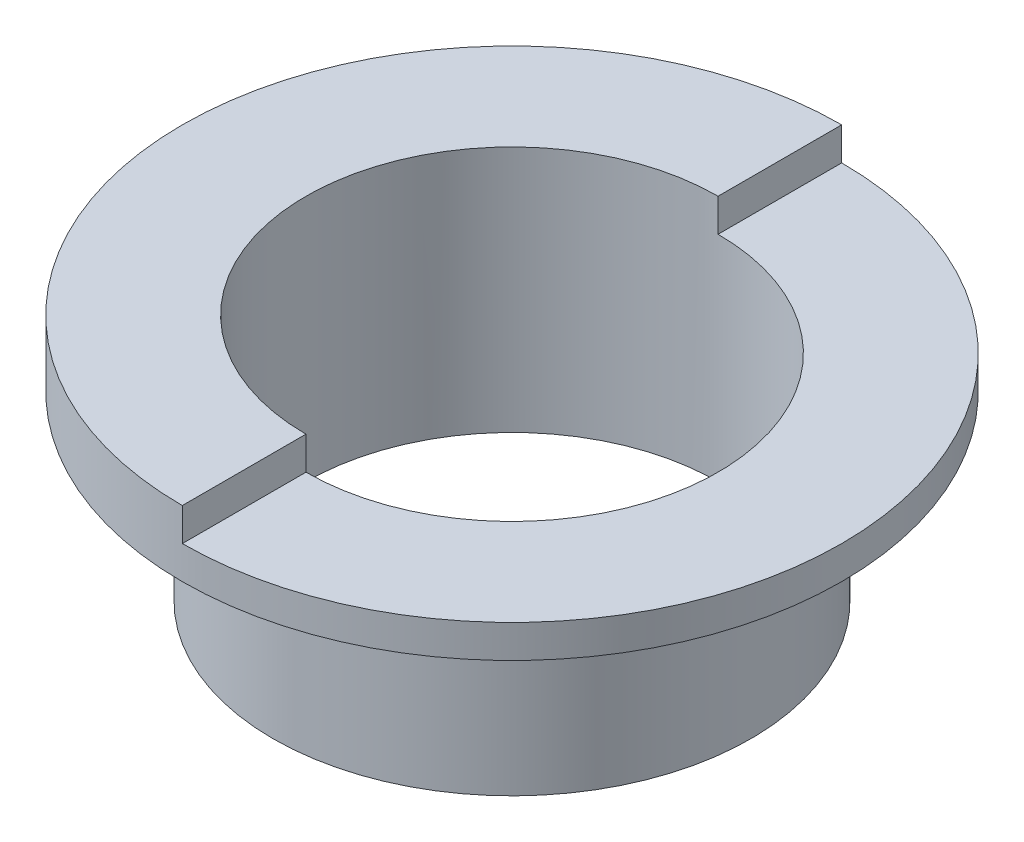
ISO-10303-21;
HEADER;
FILE_DESCRIPTION(('STEP AP214'),'2;1');
FILE_NAME('part.step','',(''),(''),'','','');
FILE_SCHEMA(('AUTOMOTIVE_DESIGN { 1 0 10303 214 1 1 1 1 }'));
ENDSEC;
DATA;
#1=APPLICATION_CONTEXT('core data for automotive mechanical design processes');
#2=APPLICATION_PROTOCOL_DEFINITION('international standard','automotive_design',2000,#1);
#3=PRODUCT_CONTEXT('',#1,'mechanical');
#4=PRODUCT('Part','Part','',(#3));
#5=PRODUCT_RELATED_PRODUCT_CATEGORY('part','',(#4));
#6=PRODUCT_DEFINITION_FORMATION('','',#4);
#7=PRODUCT_DEFINITION_CONTEXT('part definition',#1,'design');
#8=PRODUCT_DEFINITION('design','',#6,#7);
#9=PRODUCT_DEFINITION_SHAPE('','',#8);
#10=(LENGTH_UNIT() NAMED_UNIT(*) SI_UNIT(.MILLI.,.METRE.));
#11=(NAMED_UNIT(*) PLANE_ANGLE_UNIT() SI_UNIT($,.RADIAN.));
#12=(NAMED_UNIT(*) SI_UNIT($,.STERADIAN.) SOLID_ANGLE_UNIT());
#13=UNCERTAINTY_MEASURE_WITH_UNIT(LENGTH_MEASURE(1.E-05),#10,'distance_accuracy_value','');
#14=(GEOMETRIC_REPRESENTATION_CONTEXT(3) GLOBAL_UNCERTAINTY_ASSIGNED_CONTEXT((#13)) GLOBAL_UNIT_ASSIGNED_CONTEXT((#10,
#11,#12)) REPRESENTATION_CONTEXT('',''));
#15=CARTESIAN_POINT('',(0.,0.,0.));
#16=DIRECTION('',(0.,0.,1.));
#17=DIRECTION('',(1.,0.,0.));
#18=AXIS2_PLACEMENT_3D('',#15,#16,#17);
#19=CARTESIAN_POINT('',(0.,0.,0.));
#20=DIRECTION('',(0.,1.,0.));
#21=DIRECTION('',(0.,0.,1.));
#22=AXIS2_PLACEMENT_3D('',#19,#20,#21);
#23=PLANE('',#22);
#24=CARTESIAN_POINT('',(0.,0.,0.));
#25=DIRECTION('',(0.,1.,0.));
#26=DIRECTION('',(0.,0.,1.));
#27=AXIS2_PLACEMENT_3D('',#24,#25,#26);
#28=CIRCLE('',#27,14.5);
#29=CARTESIAN_POINT('',(0.,0.,14.5));
#30=VERTEX_POINT('',#29);
#31=EDGE_CURVE('E37',#30,#30,#28,.T.);
#32=ORIENTED_EDGE('',*,*,#31,.F.);
#33=EDGE_LOOP('',(#32));
#34=FACE_BOUND('',#33,.T.);
#35=CARTESIAN_POINT('',(0.,0.,0.));
#36=DIRECTION('',(0.,1.,0.));
#37=DIRECTION('',(0.,0.,1.));
#38=AXIS2_PLACEMENT_3D('',#35,#36,#37);
#39=CIRCLE('',#38,12.5);
#40=CARTESIAN_POINT('',(0.,0.,12.5));
#41=VERTEX_POINT('',#40);
#42=EDGE_CURVE('E103',#41,#41,#39,.T.);
#43=ORIENTED_EDGE('',*,*,#42,.T.);
#44=EDGE_LOOP('',(#43));
#45=FACE_BOUND('',#44,.T.);
#46=ADVANCED_FACE('F33',(#34,#45),#23,.F.);
#47=CARTESIAN_POINT('',(0.,11.,0.));
#48=DIRECTION('',(0.,-1.,0.));
#49=DIRECTION('',(0.,0.,-1.));
#50=AXIS2_PLACEMENT_3D('',#47,#48,#49);
#51=CYLINDRICAL_SURFACE('',#50,14.5);
#52=CARTESIAN_POINT('',(0.,11.,0.));
#53=DIRECTION('',(0.,1.,0.));
#54=DIRECTION('',(0.,0.,1.));
#55=AXIS2_PLACEMENT_3D('',#52,#53,#54);
#56=CIRCLE('',#55,14.5);
#57=CARTESIAN_POINT('',(0.,11.,14.5));
#58=VERTEX_POINT('',#57);
#59=EDGE_CURVE('E11',#58,#58,#56,.T.);
#60=ORIENTED_EDGE('',*,*,#59,.F.);
#61=EDGE_LOOP('',(#60));
#62=FACE_BOUND('',#61,.T.);
#63=ORIENTED_EDGE('',*,*,#31,.T.);
#64=EDGE_LOOP('',(#63));
#65=FACE_BOUND('',#64,.T.);
#66=ADVANCED_FACE('F35',(#62,#65),#51,.T.);
#67=CARTESIAN_POINT('',(0.,11.,0.));
#68=DIRECTION('',(0.,-1.,0.));
#69=DIRECTION('',(0.,0.,-1.));
#70=AXIS2_PLACEMENT_3D('',#67,#68,#69);
#71=CYLINDRICAL_SURFACE('',#70,12.5);
#72=ORIENTED_EDGE('',*,*,#42,.F.);
#73=EDGE_LOOP('',(#72));
#74=FACE_BOUND('',#73,.T.);
#75=CARTESIAN_POINT('',(0.,13.,0.));
#76=DIRECTION('',(0.,1.,0.));
#77=DIRECTION('',(0.,0.,1.));
#78=AXIS2_PLACEMENT_3D('',#75,#76,#77);
#79=CIRCLE('',#78,12.5);
#80=CARTESIAN_POINT('',(0.,13.,12.5));
#81=VERTEX_POINT('',#80);
#82=CARTESIAN_POINT('',(0.,13.,-12.5));
#83=VERTEX_POINT('',#82);
#84=EDGE_CURVE('E52',#81,#83,#79,.T.);
#85=ORIENTED_EDGE('',*,*,#84,.T.);
#86=DIRECTION('',(0.,-1.,0.));
#87=VECTOR('',#86,1.);
#88=CARTESIAN_POINT('',(0.,15.,-12.5));
#89=LINE('',#88,#87);
#90=CARTESIAN_POINT('',(0.,15.,-12.5));
#91=VERTEX_POINT('',#90);
#92=EDGE_CURVE('E76',#91,#83,#89,.T.);
#93=ORIENTED_EDGE('',*,*,#92,.F.);
#94=CARTESIAN_POINT('',(0.,15.,0.));
#95=DIRECTION('',(0.,-1.,0.));
#96=DIRECTION('',(0.,0.,1.));
#97=AXIS2_PLACEMENT_3D('',#94,#95,#96);
#98=CIRCLE('',#97,12.5);
#99=CARTESIAN_POINT('',(0.,15.,12.5));
#100=VERTEX_POINT('',#99);
#101=EDGE_CURVE('E82',#100,#91,#98,.T.);
#102=ORIENTED_EDGE('',*,*,#101,.F.);
#103=DIRECTION('',(0.,-1.,0.));
#104=VECTOR('',#103,1.);
#105=CARTESIAN_POINT('',(0.,15.,12.5));
#106=LINE('',#105,#104);
#107=EDGE_CURVE('E202',#100,#81,#106,.T.);
#108=ORIENTED_EDGE('',*,*,#107,.T.);
#109=EDGE_LOOP('',(#85,#93,#102,#108));
#110=FACE_BOUND('',#109,.T.);
#111=ADVANCED_FACE('F93',(#74,#110),#71,.F.);
#112=CARTESIAN_POINT('',(0.,13.,0.));
#113=DIRECTION('',(0.,1.,0.));
#114=DIRECTION('',(0.,0.,1.));
#115=AXIS2_PLACEMENT_3D('',#112,#113,#114);
#116=PLANE('',#115);
#117=DIRECTION('',(0.,0.,-1.));
#118=VECTOR('',#117,1.);
#119=CARTESIAN_POINT('',(0.,13.,12.5));
#120=LINE('',#119,#118);
#121=CARTESIAN_POINT('',(0.,13.,20.));
#122=VERTEX_POINT('',#121);
#123=EDGE_CURVE('E91',#122,#81,#120,.T.);
#124=ORIENTED_EDGE('',*,*,#123,.F.);
#125=CARTESIAN_POINT('',(0.,13.,0.));
#126=DIRECTION('',(0.,1.,0.));
#127=DIRECTION('',(0.,0.,1.));
#128=AXIS2_PLACEMENT_3D('',#125,#126,#127);
#129=CIRCLE('',#128,20.);
#130=CARTESIAN_POINT('',(0.,13.,-20.));
#131=VERTEX_POINT('',#130);
#132=EDGE_CURVE('E101',#122,#131,#129,.T.);
#133=ORIENTED_EDGE('',*,*,#132,.T.);
#134=DIRECTION('',(0.,0.,-1.));
#135=VECTOR('',#134,1.);
#136=CARTESIAN_POINT('',(0.,13.,-20.));
#137=LINE('',#136,#135);
#138=EDGE_CURVE('E48',#83,#131,#137,.T.);
#139=ORIENTED_EDGE('',*,*,#138,.F.);
#140=ORIENTED_EDGE('',*,*,#84,.F.);
#141=EDGE_LOOP('',(#124,#133,#139,#140));
#142=FACE_BOUND('',#141,.T.);
#143=ADVANCED_FACE('F121',(#142),#116,.T.);
#144=CARTESIAN_POINT('',(0.,11.,0.));
#145=DIRECTION('',(0.,1.,0.));
#146=DIRECTION('',(0.,0.,1.));
#147=AXIS2_PLACEMENT_3D('',#144,#145,#146);
#148=PLANE('',#147);
#149=ORIENTED_EDGE('',*,*,#59,.T.);
#150=EDGE_LOOP('',(#149));
#151=FACE_BOUND('',#150,.T.);
#152=CARTESIAN_POINT('',(0.,11.,0.));
#153=DIRECTION('',(0.,1.,0.));
#154=DIRECTION('',(0.,0.,1.));
#155=AXIS2_PLACEMENT_3D('',#152,#153,#154);
#156=CIRCLE('',#155,20.);
#157=CARTESIAN_POINT('',(0.,11.,20.));
#158=VERTEX_POINT('',#157);
#159=EDGE_CURVE('E95',#158,#158,#156,.T.);
#160=ORIENTED_EDGE('',*,*,#159,.F.);
#161=EDGE_LOOP('',(#160));
#162=FACE_BOUND('',#161,.T.);
#163=ADVANCED_FACE('F126',(#151,#162),#148,.F.);
#164=CARTESIAN_POINT('',(0.,13.,0.));
#165=DIRECTION('',(0.,-1.,0.));
#166=DIRECTION('',(0.,0.,-1.));
#167=AXIS2_PLACEMENT_3D('',#164,#165,#166);
#168=CYLINDRICAL_SURFACE('',#167,20.);
#169=ORIENTED_EDGE('',*,*,#132,.F.);
#170=DIRECTION('',(0.,-1.,0.));
#171=VECTOR('',#170,1.);
#172=CARTESIAN_POINT('',(0.,15.,20.));
#173=LINE('',#172,#171);
#174=CARTESIAN_POINT('',(0.,15.,20.));
#175=VERTEX_POINT('',#174);
#176=EDGE_CURVE('E97',#175,#122,#173,.T.);
#177=ORIENTED_EDGE('',*,*,#176,.F.);
#178=CARTESIAN_POINT('',(0.,15.,0.));
#179=DIRECTION('',(0.,1.,0.));
#180=DIRECTION('',(0.,0.,1.));
#181=AXIS2_PLACEMENT_3D('',#178,#179,#180);
#182=CIRCLE('',#181,20.);
#183=CARTESIAN_POINT('',(0.,15.,-20.));
#184=VERTEX_POINT('',#183);
#185=EDGE_CURVE('E81',#184,#175,#182,.T.);
#186=ORIENTED_EDGE('',*,*,#185,.F.);
#187=DIRECTION('',(0.,-1.,0.));
#188=VECTOR('',#187,1.);
#189=CARTESIAN_POINT('',(0.,15.,-20.));
#190=LINE('',#189,#188);
#191=EDGE_CURVE('E78',#184,#131,#190,.T.);
#192=ORIENTED_EDGE('',*,*,#191,.T.);
#193=EDGE_LOOP('',(#169,#177,#186,#192));
#194=FACE_BOUND('',#193,.T.);
#195=ORIENTED_EDGE('',*,*,#159,.T.);
#196=EDGE_LOOP('',(#195));
#197=FACE_BOUND('',#196,.T.);
#198=ADVANCED_FACE('F123',(#194,#197),#168,.T.);
#199=CARTESIAN_POINT('',(0.,15.,-20.));
#200=DIRECTION('',(-1.,0.,0.));
#201=DIRECTION('',(0.,0.,1.));
#202=AXIS2_PLACEMENT_3D('',#199,#200,#201);
#203=PLANE('',#202);
#204=ORIENTED_EDGE('',*,*,#138,.T.);
#205=ORIENTED_EDGE('',*,*,#191,.F.);
#206=DIRECTION('',(0.,0.,-1.));
#207=VECTOR('',#206,1.);
#208=CARTESIAN_POINT('',(0.,15.,-20.));
#209=LINE('',#208,#207);
#210=EDGE_CURVE('E72',#91,#184,#209,.T.);
#211=ORIENTED_EDGE('',*,*,#210,.F.);
#212=ORIENTED_EDGE('',*,*,#92,.T.);
#213=EDGE_LOOP('',(#204,#205,#211,#212));
#214=FACE_BOUND('',#213,.T.);
#215=ADVANCED_FACE('F74',(#214),#203,.F.);
#216=CARTESIAN_POINT('',(0.,15.,12.5));
#217=DIRECTION('',(-1.,0.,0.));
#218=DIRECTION('',(0.,0.,1.));
#219=AXIS2_PLACEMENT_3D('',#216,#217,#218);
#220=PLANE('',#219);
#221=ORIENTED_EDGE('',*,*,#123,.T.);
#222=ORIENTED_EDGE('',*,*,#107,.F.);
#223=DIRECTION('',(0.,0.,-1.));
#224=VECTOR('',#223,1.);
#225=CARTESIAN_POINT('',(0.,15.,12.5));
#226=LINE('',#225,#224);
#227=EDGE_CURVE('E87',#175,#100,#226,.T.);
#228=ORIENTED_EDGE('',*,*,#227,.F.);
#229=ORIENTED_EDGE('',*,*,#176,.T.);
#230=EDGE_LOOP('',(#221,#222,#228,#229));
#231=FACE_BOUND('',#230,.T.);
#232=ADVANCED_FACE('F135',(#231),#220,.F.);
#233=CARTESIAN_POINT('',(0.,15.,0.));
#234=DIRECTION('',(0.,1.,0.));
#235=DIRECTION('',(0.,0.,1.));
#236=AXIS2_PLACEMENT_3D('',#233,#234,#235);
#237=PLANE('',#236);
#238=ORIENTED_EDGE('',*,*,#101,.T.);
#239=ORIENTED_EDGE('',*,*,#210,.T.);
#240=ORIENTED_EDGE('',*,*,#185,.T.);
#241=ORIENTED_EDGE('',*,*,#227,.T.);
#242=EDGE_LOOP('',(#238,#239,#240,#241));
#243=FACE_BOUND('',#242,.T.);
#244=ADVANCED_FACE('F85',(#243),#237,.T.);
#245=CLOSED_SHELL('',(#46,#66,#111,#143,#163,#198,#215,#232,#244));
#246=MANIFOLD_SOLID_BREP('B2',#245);
#247=ADVANCED_BREP_SHAPE_REPRESENTATION('',(#18,#246),#14);
#248=SHAPE_DEFINITION_REPRESENTATION(#9,#247);
ENDSEC;
END-ISO-10303-21;
